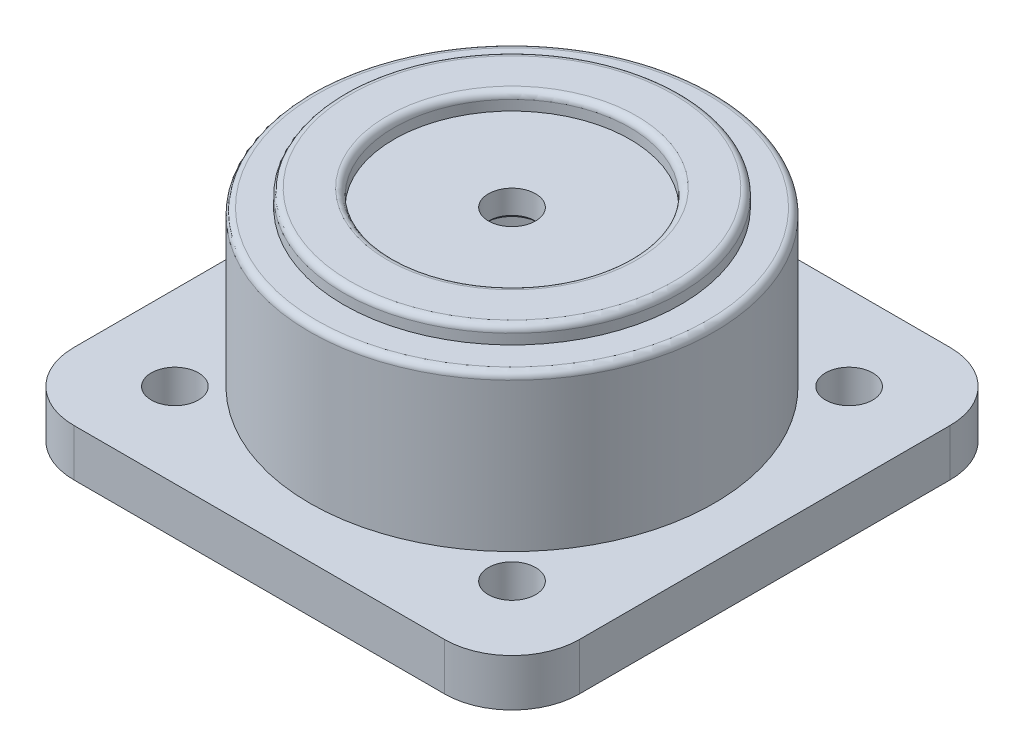
ISO-10303-21;
HEADER;
FILE_DESCRIPTION(('STEP AP214'),'2;1');
FILE_NAME('part.step','',(''),(''),'','','');
FILE_SCHEMA(('AUTOMOTIVE_DESIGN { 1 0 10303 214 1 1 1 1 }'));
ENDSEC;
DATA;
#1=APPLICATION_CONTEXT('core data for automotive mechanical design processes');
#2=APPLICATION_PROTOCOL_DEFINITION('international standard','automotive_design',2000,#1);
#3=PRODUCT_CONTEXT('',#1,'mechanical');
#4=PRODUCT('Part','Part','',(#3));
#5=PRODUCT_RELATED_PRODUCT_CATEGORY('part','',(#4));
#6=PRODUCT_DEFINITION_FORMATION('','',#4);
#7=PRODUCT_DEFINITION_CONTEXT('part definition',#1,'design');
#8=PRODUCT_DEFINITION('design','',#6,#7);
#9=PRODUCT_DEFINITION_SHAPE('','',#8);
#10=(LENGTH_UNIT() NAMED_UNIT(*) SI_UNIT(.MILLI.,.METRE.));
#11=(NAMED_UNIT(*) PLANE_ANGLE_UNIT() SI_UNIT($,.RADIAN.));
#12=(NAMED_UNIT(*) SI_UNIT($,.STERADIAN.) SOLID_ANGLE_UNIT());
#13=UNCERTAINTY_MEASURE_WITH_UNIT(LENGTH_MEASURE(1.E-05),#10,'distance_accuracy_value','');
#14=(GEOMETRIC_REPRESENTATION_CONTEXT(3) GLOBAL_UNCERTAINTY_ASSIGNED_CONTEXT((#13)) GLOBAL_UNIT_ASSIGNED_CONTEXT((#10,
#11,#12)) REPRESENTATION_CONTEXT('',''));
#15=CARTESIAN_POINT('',(0.,0.,0.));
#16=DIRECTION('',(0.,0.,1.));
#17=DIRECTION('',(1.,0.,0.));
#18=AXIS2_PLACEMENT_3D('',#15,#16,#17);
#19=CARTESIAN_POINT('',(0.,30.,0.));
#20=DIRECTION('',(0.,1.,0.));
#21=DIRECTION('',(0.,0.,1.));
#22=AXIS2_PLACEMENT_3D('',#19,#20,#21);
#23=PLANE('',#22);
#24=CARTESIAN_POINT('',(0.,30.,0.));
#25=DIRECTION('',(0.,-1.,0.));
#26=DIRECTION('',(0.,0.,-1.));
#27=AXIS2_PLACEMENT_3D('',#24,#25,#26);
#28=CIRCLE('',#27,3.5);
#29=CARTESIAN_POINT('',(0.,30.,-3.5));
#30=VERTEX_POINT('',#29);
#31=EDGE_CURVE('E161',#30,#30,#28,.T.);
#32=ORIENTED_EDGE('',*,*,#31,.T.);
#33=EDGE_LOOP('',(#32));
#34=FACE_BOUND('',#33,.T.);
#35=CARTESIAN_POINT('',(0.,30.,0.));
#36=DIRECTION('',(0.,1.,0.));
#37=DIRECTION('',(0.,0.,1.));
#38=AXIS2_PLACEMENT_3D('',#35,#36,#37);
#39=CIRCLE('',#38,17.5);
#40=CARTESIAN_POINT('',(0.,30.,17.5));
#41=VERTEX_POINT('',#40);
#42=EDGE_CURVE('E278',#41,#41,#39,.F.);
#43=ORIENTED_EDGE('',*,*,#42,.F.);
#44=EDGE_LOOP('',(#43));
#45=FACE_BOUND('',#44,.T.);
#46=ADVANCED_FACE('F39',(#34,#45),#23,.T.);
#47=CARTESIAN_POINT('',(0.,26.,0.));
#48=DIRECTION('',(0.,1.,0.));
#49=DIRECTION('',(0.,0.,1.));
#50=AXIS2_PLACEMENT_3D('',#47,#48,#49);
#51=PLANE('',#50);
#52=CARTESIAN_POINT('',(0.,26.,0.));
#53=DIRECTION('',(0.,1.,0.));
#54=DIRECTION('',(0.,0.,1.));
#55=AXIS2_PLACEMENT_3D('',#52,#53,#54);
#56=CIRCLE('',#55,4.);
#57=CARTESIAN_POINT('',(0.,26.,4.));
#58=VERTEX_POINT('',#57);
#59=EDGE_CURVE('E266',#58,#58,#56,.T.);
#60=ORIENTED_EDGE('',*,*,#59,.T.);
#61=EDGE_LOOP('',(#60));
#62=FACE_BOUND('',#61,.T.);
#63=CARTESIAN_POINT('',(0.,26.,0.));
#64=DIRECTION('',(0.,-1.,0.));
#65=DIRECTION('',(0.,0.,-1.));
#66=AXIS2_PLACEMENT_3D('',#63,#64,#65);
#67=CIRCLE('',#66,7.5);
#68=CARTESIAN_POINT('',(0.,26.,-7.5));
#69=VERTEX_POINT('',#68);
#70=EDGE_CURVE('E147',#69,#69,#67,.T.);
#71=ORIENTED_EDGE('',*,*,#70,.T.);
#72=EDGE_LOOP('',(#71));
#73=FACE_BOUND('',#72,.T.);
#74=ADVANCED_FACE('F308',(#62,#73),#51,.F.);
#75=CARTESIAN_POINT('',(0.,30.,0.));
#76=DIRECTION('',(0.,-1.,0.));
#77=DIRECTION('',(0.,0.,-1.));
#78=AXIS2_PLACEMENT_3D('',#75,#76,#77);
#79=CYLINDRICAL_SURFACE('',#78,30.);
#80=CARTESIAN_POINT('',(0.,29.,0.));
#81=DIRECTION('',(0.,1.,0.));
#82=DIRECTION('',(0.,0.,1.));
#83=AXIS2_PLACEMENT_3D('',#80,#81,#82);
#84=CIRCLE('',#83,30.);
#85=CARTESIAN_POINT('',(0.,29.,30.));
#86=VERTEX_POINT('',#85);
#87=EDGE_CURVE('E12',#86,#86,#84,.F.);
#88=ORIENTED_EDGE('',*,*,#87,.T.);
#89=EDGE_LOOP('',(#88));
#90=FACE_BOUND('',#89,.T.);
#91=CARTESIAN_POINT('',(0.,23.,0.));
#92=DIRECTION('',(0.,1.,0.));
#93=DIRECTION('',(-1.,0.,0.));
#94=AXIS2_PLACEMENT_3D('',#91,#92,#93);
#95=CIRCLE('',#94,30.);
#96=CARTESIAN_POINT('',(6.,23.,-29.3938769133981));
#97=VERTEX_POINT('',#96);
#98=CARTESIAN_POINT('',(-6.,23.,-29.3938769133981));
#99=VERTEX_POINT('',#98);
#100=EDGE_CURVE('E146',#97,#99,#95,.T.);
#101=ORIENTED_EDGE('',*,*,#100,.T.);
#102=DIRECTION('',(0.,-1.,0.));
#103=VECTOR('',#102,1.);
#104=CARTESIAN_POINT('',(-6.,30.,-29.3938769133981));
#105=LINE('',#104,#103);
#106=CARTESIAN_POINT('',(-6.,15.,-29.3938769133981));
#107=VERTEX_POINT('',#106);
#108=EDGE_CURVE('E136',#99,#107,#105,.T.);
#109=ORIENTED_EDGE('',*,*,#108,.T.);
#110=CARTESIAN_POINT('',(0.,15.,0.));
#111=DIRECTION('',(0.,-1.,0.));
#112=DIRECTION('',(0.,0.,-1.));
#113=AXIS2_PLACEMENT_3D('',#110,#111,#112);
#114=CIRCLE('',#113,30.);
#115=CARTESIAN_POINT('',(6.,15.,-29.3938769133981));
#116=VERTEX_POINT('',#115);
#117=EDGE_CURVE('E125',#107,#116,#114,.T.);
#118=ORIENTED_EDGE('',*,*,#117,.T.);
#119=DIRECTION('',(0.,-1.,0.));
#120=VECTOR('',#119,1.);
#121=CARTESIAN_POINT('',(6.,30.,-29.3938769133981));
#122=LINE('',#121,#120);
#123=EDGE_CURVE('E130',#116,#97,#122,.F.);
#124=ORIENTED_EDGE('',*,*,#123,.T.);
#125=EDGE_LOOP('',(#101,#109,#118,#124));
#126=FACE_BOUND('',#125,.T.);
#127=CARTESIAN_POINT('',(0.,7.,0.));
#128=DIRECTION('',(0.,-1.,0.));
#129=DIRECTION('',(0.,0.,-1.));
#130=AXIS2_PLACEMENT_3D('',#127,#128,#129);
#131=CIRCLE('',#130,30.);
#132=CARTESIAN_POINT('',(0.,7.,-30.));
#133=VERTEX_POINT('',#132);
#134=EDGE_CURVE('E247',#133,#133,#131,.T.);
#135=ORIENTED_EDGE('',*,*,#134,.F.);
#136=EDGE_LOOP('',(#135));
#137=FACE_BOUND('',#136,.T.);
#138=ADVANCED_FACE('F144',(#90,#126,#137),#79,.T.);
#139=CARTESIAN_POINT('',(0.,30.,0.));
#140=DIRECTION('',(0.,1.,0.));
#141=DIRECTION('',(0.,0.,1.));
#142=AXIS2_PLACEMENT_3D('',#139,#140,#141);
#143=CIRCLE('',#142,29.);
#144=CARTESIAN_POINT('',(0.,30.,29.));
#145=VERTEX_POINT('',#144);
#146=EDGE_CURVE('E47',#145,#145,#143,.T.);
#147=ORIENTED_EDGE('',*,*,#146,.T.);
#148=EDGE_LOOP('',(#147));
#149=FACE_BOUND('',#148,.T.);
#150=CARTESIAN_POINT('',(0.,30.,0.));
#151=DIRECTION('',(0.,1.,0.));
#152=DIRECTION('',(0.,0.,1.));
#153=AXIS2_PLACEMENT_3D('',#150,#151,#152);
#154=CIRCLE('',#153,25.);
#155=CARTESIAN_POINT('',(0.,30.,25.));
#156=VERTEX_POINT('',#155);
#157=EDGE_CURVE('E141',#156,#156,#154,.T.);
#158=ORIENTED_EDGE('',*,*,#157,.F.);
#159=EDGE_LOOP('',(#158));
#160=FACE_BOUND('',#159,.T.);
#161=ADVANCED_FACE('F295',(#149,#160),#23,.T.);
#162=CARTESIAN_POINT('',(27.5000000000001,7.,27.5));
#163=DIRECTION('',(0.,-1.,0.));
#164=DIRECTION('',(0.,0.,-1.));
#165=AXIS2_PLACEMENT_3D('',#162,#163,#164);
#166=CYLINDRICAL_SURFACE('',#165,10.);
#167=CARTESIAN_POINT('',(27.5000000000001,0.,27.5));
#168=DIRECTION('',(0.,-1.,0.));
#169=DIRECTION('',(0.,0.,-1.));
#170=AXIS2_PLACEMENT_3D('',#167,#168,#169);
#171=CIRCLE('',#170,10.);
#172=CARTESIAN_POINT('',(37.5000000000001,0.,27.5));
#173=VERTEX_POINT('',#172);
#174=CARTESIAN_POINT('',(27.5000000000001,0.,37.5));
#175=VERTEX_POINT('',#174);
#176=EDGE_CURVE('E194',#173,#175,#171,.T.);
#177=ORIENTED_EDGE('',*,*,#176,.F.);
#178=DIRECTION('',(0.,-1.,0.));
#179=VECTOR('',#178,1.);
#180=CARTESIAN_POINT('',(37.5000000000001,7.,27.5));
#181=LINE('',#180,#179);
#182=CARTESIAN_POINT('',(37.5000000000001,7.,27.5));
#183=VERTEX_POINT('',#182);
#184=EDGE_CURVE('E245',#183,#173,#181,.T.);
#185=ORIENTED_EDGE('',*,*,#184,.F.);
#186=CARTESIAN_POINT('',(27.5000000000001,7.,27.5));
#187=DIRECTION('',(0.,-1.,0.));
#188=DIRECTION('',(0.,0.,-1.));
#189=AXIS2_PLACEMENT_3D('',#186,#187,#188);
#190=CIRCLE('',#189,10.);
#191=CARTESIAN_POINT('',(27.5000000000001,7.,37.5));
#192=VERTEX_POINT('',#191);
#193=EDGE_CURVE('E197',#183,#192,#190,.T.);
#194=ORIENTED_EDGE('',*,*,#193,.T.);
#195=DIRECTION('',(0.,-1.,0.));
#196=VECTOR('',#195,1.);
#197=CARTESIAN_POINT('',(27.5000000000001,7.,37.5));
#198=LINE('',#197,#196);
#199=EDGE_CURVE('E222',#192,#175,#198,.T.);
#200=ORIENTED_EDGE('',*,*,#199,.T.);
#201=EDGE_LOOP('',(#177,#185,#194,#200));
#202=FACE_BOUND('',#201,.T.);
#203=ADVANCED_FACE('F321',(#202),#166,.T.);
#204=CARTESIAN_POINT('',(37.5000000000001,7.,-27.5));
#205=DIRECTION('',(1.,0.,0.));
#206=DIRECTION('',(0.,0.,-1.));
#207=AXIS2_PLACEMENT_3D('',#204,#205,#206);
#208=PLANE('',#207);
#209=DIRECTION('',(0.,0.,1.));
#210=VECTOR('',#209,1.);
#211=CARTESIAN_POINT('',(37.5000000000001,0.,-27.5));
#212=LINE('',#211,#210);
#213=CARTESIAN_POINT('',(37.5000000000001,0.,-27.5));
#214=VERTEX_POINT('',#213);
#215=EDGE_CURVE('E201',#214,#173,#212,.T.);
#216=ORIENTED_EDGE('',*,*,#215,.F.);
#217=DIRECTION('',(0.,-1.,0.));
#218=VECTOR('',#217,1.);
#219=CARTESIAN_POINT('',(37.5000000000001,7.,-27.5));
#220=LINE('',#219,#218);
#221=CARTESIAN_POINT('',(37.5000000000001,7.,-27.5));
#222=VERTEX_POINT('',#221);
#223=EDGE_CURVE('E248',#222,#214,#220,.T.);
#224=ORIENTED_EDGE('',*,*,#223,.F.);
#225=DIRECTION('',(0.,0.,1.));
#226=VECTOR('',#225,1.);
#227=CARTESIAN_POINT('',(37.5000000000001,7.,-27.5));
#228=LINE('',#227,#226);
#229=EDGE_CURVE('E219',#222,#183,#228,.T.);
#230=ORIENTED_EDGE('',*,*,#229,.T.);
#231=ORIENTED_EDGE('',*,*,#184,.T.);
#232=EDGE_LOOP('',(#216,#224,#230,#231));
#233=FACE_BOUND('',#232,.T.);
#234=ADVANCED_FACE('F326',(#233),#208,.T.);
#235=CARTESIAN_POINT('',(27.5000000000001,7.,-27.5));
#236=DIRECTION('',(0.,-1.,0.));
#237=DIRECTION('',(0.,0.,-1.));
#238=AXIS2_PLACEMENT_3D('',#235,#236,#237);
#239=CYLINDRICAL_SURFACE('',#238,10.);
#240=CARTESIAN_POINT('',(27.5000000000001,0.,-27.5));
#241=DIRECTION('',(0.,-1.,0.));
#242=DIRECTION('',(0.,0.,1.));
#243=AXIS2_PLACEMENT_3D('',#240,#241,#242);
#244=CIRCLE('',#243,10.);
#245=CARTESIAN_POINT('',(27.5000000000001,0.,-37.5));
#246=VERTEX_POINT('',#245);
#247=EDGE_CURVE('E240',#246,#214,#244,.T.);
#248=ORIENTED_EDGE('',*,*,#247,.F.);
#249=DIRECTION('',(0.,-1.,0.));
#250=VECTOR('',#249,1.);
#251=CARTESIAN_POINT('',(27.5000000000001,7.,-37.5));
#252=LINE('',#251,#250);
#253=CARTESIAN_POINT('',(27.5000000000001,7.,-37.5));
#254=VERTEX_POINT('',#253);
#255=EDGE_CURVE('E250',#254,#246,#252,.T.);
#256=ORIENTED_EDGE('',*,*,#255,.F.);
#257=CARTESIAN_POINT('',(27.5000000000001,7.,-27.5));
#258=DIRECTION('',(0.,-1.,0.));
#259=DIRECTION('',(0.,0.,1.));
#260=AXIS2_PLACEMENT_3D('',#257,#258,#259);
#261=CIRCLE('',#260,10.);
#262=EDGE_CURVE('E216',#254,#222,#261,.T.);
#263=ORIENTED_EDGE('',*,*,#262,.T.);
#264=ORIENTED_EDGE('',*,*,#223,.T.);
#265=EDGE_LOOP('',(#248,#256,#263,#264));
#266=FACE_BOUND('',#265,.T.);
#267=ADVANCED_FACE('F425',(#266),#239,.T.);
#268=CARTESIAN_POINT('',(-27.5000000000001,7.,-37.5));
#269=DIRECTION('',(0.,0.,-1.));
#270=DIRECTION('',(-1.,0.,0.));
#271=AXIS2_PLACEMENT_3D('',#268,#269,#270);
#272=PLANE('',#271);
#273=DIRECTION('',(1.,0.,0.));
#274=VECTOR('',#273,1.);
#275=CARTESIAN_POINT('',(-27.5000000000001,0.,-37.5));
#276=LINE('',#275,#274);
#277=CARTESIAN_POINT('',(-27.5000000000001,0.,-37.5));
#278=VERTEX_POINT('',#277);
#279=EDGE_CURVE('E237',#278,#246,#276,.T.);
#280=ORIENTED_EDGE('',*,*,#279,.F.);
#281=DIRECTION('',(0.,-1.,0.));
#282=VECTOR('',#281,1.);
#283=CARTESIAN_POINT('',(-27.5000000000001,7.,-37.5));
#284=LINE('',#283,#282);
#285=CARTESIAN_POINT('',(-27.5000000000001,7.,-37.5));
#286=VERTEX_POINT('',#285);
#287=EDGE_CURVE('E252',#286,#278,#284,.T.);
#288=ORIENTED_EDGE('',*,*,#287,.F.);
#289=DIRECTION('',(1.,0.,0.));
#290=VECTOR('',#289,1.);
#291=CARTESIAN_POINT('',(-27.5000000000001,7.,-37.5));
#292=LINE('',#291,#290);
#293=EDGE_CURVE('E213',#286,#254,#292,.T.);
#294=ORIENTED_EDGE('',*,*,#293,.T.);
#295=ORIENTED_EDGE('',*,*,#255,.T.);
#296=EDGE_LOOP('',(#280,#288,#294,#295));
#297=FACE_BOUND('',#296,.T.);
#298=ADVANCED_FACE('F429',(#297),#272,.T.);
#299=CARTESIAN_POINT('',(-27.5000000000001,7.,-27.5));
#300=DIRECTION('',(0.,-1.,0.));
#301=DIRECTION('',(0.,0.,-1.));
#302=AXIS2_PLACEMENT_3D('',#299,#300,#301);
#303=CYLINDRICAL_SURFACE('',#302,10.);
#304=CARTESIAN_POINT('',(-27.5000000000001,0.,-27.5));
#305=DIRECTION('',(0.,-1.,0.));
#306=DIRECTION('',(0.,0.,1.));
#307=AXIS2_PLACEMENT_3D('',#304,#305,#306);
#308=CIRCLE('',#307,10.);
#309=CARTESIAN_POINT('',(-37.5000000000001,0.,-27.5));
#310=VERTEX_POINT('',#309);
#311=EDGE_CURVE('E234',#310,#278,#308,.T.);
#312=ORIENTED_EDGE('',*,*,#311,.F.);
#313=DIRECTION('',(0.,-1.,0.));
#314=VECTOR('',#313,1.);
#315=CARTESIAN_POINT('',(-37.5000000000001,7.,-27.5));
#316=LINE('',#315,#314);
#317=CARTESIAN_POINT('',(-37.5000000000001,7.,-27.5));
#318=VERTEX_POINT('',#317);
#319=EDGE_CURVE('E254',#318,#310,#316,.T.);
#320=ORIENTED_EDGE('',*,*,#319,.F.);
#321=CARTESIAN_POINT('',(-27.5000000000001,7.,-27.5));
#322=DIRECTION('',(0.,-1.,0.));
#323=DIRECTION('',(0.,0.,1.));
#324=AXIS2_PLACEMENT_3D('',#321,#322,#323);
#325=CIRCLE('',#324,10.);
#326=EDGE_CURVE('E210',#318,#286,#325,.T.);
#327=ORIENTED_EDGE('',*,*,#326,.T.);
#328=ORIENTED_EDGE('',*,*,#287,.T.);
#329=EDGE_LOOP('',(#312,#320,#327,#328));
#330=FACE_BOUND('',#329,.T.);
#331=ADVANCED_FACE('F433',(#330),#303,.T.);
#332=CARTESIAN_POINT('',(-37.5000000000001,7.,-27.5));
#333=DIRECTION('',(-1.,0.,0.));
#334=DIRECTION('',(0.,0.,1.));
#335=AXIS2_PLACEMENT_3D('',#332,#333,#334);
#336=PLANE('',#335);
#337=DIRECTION('',(0.,0.,-1.));
#338=VECTOR('',#337,1.);
#339=CARTESIAN_POINT('',(-37.5000000000001,0.,-27.5));
#340=LINE('',#339,#338);
#341=CARTESIAN_POINT('',(-37.5000000000001,0.,27.5));
#342=VERTEX_POINT('',#341);
#343=EDGE_CURVE('E231',#342,#310,#340,.T.);
#344=ORIENTED_EDGE('',*,*,#343,.F.);
#345=DIRECTION('',(0.,-1.,0.));
#346=VECTOR('',#345,1.);
#347=CARTESIAN_POINT('',(-37.5000000000001,7.,27.5));
#348=LINE('',#347,#346);
#349=CARTESIAN_POINT('',(-37.5000000000001,7.,27.5));
#350=VERTEX_POINT('',#349);
#351=EDGE_CURVE('E256',#350,#342,#348,.T.);
#352=ORIENTED_EDGE('',*,*,#351,.F.);
#353=DIRECTION('',(0.,0.,-1.));
#354=VECTOR('',#353,1.);
#355=CARTESIAN_POINT('',(-37.5000000000001,7.,-27.5));
#356=LINE('',#355,#354);
#357=EDGE_CURVE('E207',#350,#318,#356,.T.);
#358=ORIENTED_EDGE('',*,*,#357,.T.);
#359=ORIENTED_EDGE('',*,*,#319,.T.);
#360=EDGE_LOOP('',(#344,#352,#358,#359));
#361=FACE_BOUND('',#360,.T.);
#362=ADVANCED_FACE('F437',(#361),#336,.T.);
#363=CARTESIAN_POINT('',(-27.5000000000001,7.,27.5));
#364=DIRECTION('',(0.,-1.,0.));
#365=DIRECTION('',(0.,0.,-1.));
#366=AXIS2_PLACEMENT_3D('',#363,#364,#365);
#367=CYLINDRICAL_SURFACE('',#366,10.);
#368=CARTESIAN_POINT('',(-27.5000000000001,0.,27.5));
#369=DIRECTION('',(0.,-1.,0.));
#370=DIRECTION('',(0.,0.,-1.));
#371=AXIS2_PLACEMENT_3D('',#368,#369,#370);
#372=CIRCLE('',#371,10.);
#373=CARTESIAN_POINT('',(-27.5000000000001,0.,37.5));
#374=VERTEX_POINT('',#373);
#375=EDGE_CURVE('E228',#374,#342,#372,.T.);
#376=ORIENTED_EDGE('',*,*,#375,.F.);
#377=DIRECTION('',(0.,-1.,0.));
#378=VECTOR('',#377,1.);
#379=CARTESIAN_POINT('',(-27.5000000000001,7.,37.5));
#380=LINE('',#379,#378);
#381=CARTESIAN_POINT('',(-27.5000000000001,7.,37.5));
#382=VERTEX_POINT('',#381);
#383=EDGE_CURVE('E258',#382,#374,#380,.T.);
#384=ORIENTED_EDGE('',*,*,#383,.F.);
#385=CARTESIAN_POINT('',(-27.5000000000001,7.,27.5));
#386=DIRECTION('',(0.,-1.,0.));
#387=DIRECTION('',(0.,0.,-1.));
#388=AXIS2_PLACEMENT_3D('',#385,#386,#387);
#389=CIRCLE('',#388,10.);
#390=EDGE_CURVE('E204',#382,#350,#389,.T.);
#391=ORIENTED_EDGE('',*,*,#390,.T.);
#392=ORIENTED_EDGE('',*,*,#351,.T.);
#393=EDGE_LOOP('',(#376,#384,#391,#392));
#394=FACE_BOUND('',#393,.T.);
#395=ADVANCED_FACE('F441',(#394),#367,.T.);
#396=CARTESIAN_POINT('',(-27.5000000000001,7.,37.5));
#397=DIRECTION('',(0.,0.,1.));
#398=DIRECTION('',(1.,0.,0.));
#399=AXIS2_PLACEMENT_3D('',#396,#397,#398);
#400=PLANE('',#399);
#401=DIRECTION('',(-1.,0.,0.));
#402=VECTOR('',#401,1.);
#403=CARTESIAN_POINT('',(-27.5000000000001,0.,37.5));
#404=LINE('',#403,#402);
#405=EDGE_CURVE('E225',#175,#374,#404,.T.);
#406=ORIENTED_EDGE('',*,*,#405,.F.);
#407=ORIENTED_EDGE('',*,*,#199,.F.);
#408=DIRECTION('',(-1.,0.,0.));
#409=VECTOR('',#408,1.);
#410=CARTESIAN_POINT('',(-27.5000000000001,7.,37.5));
#411=LINE('',#410,#409);
#412=EDGE_CURVE('E200',#192,#382,#411,.T.);
#413=ORIENTED_EDGE('',*,*,#412,.T.);
#414=ORIENTED_EDGE('',*,*,#383,.T.);
#415=EDGE_LOOP('',(#406,#407,#413,#414));
#416=FACE_BOUND('',#415,.T.);
#417=ADVANCED_FACE('F421',(#416),#400,.T.);
#418=CARTESIAN_POINT('',(27.5000000000001,7.,27.5));
#419=DIRECTION('',(0.,-1.,0.));
#420=DIRECTION('',(0.,0.,-1.));
#421=AXIS2_PLACEMENT_3D('',#418,#419,#420);
#422=PLANE('',#421);
#423=ORIENTED_EDGE('',*,*,#134,.T.);
#424=EDGE_LOOP('',(#423));
#425=FACE_BOUND('',#424,.T.);
#426=CARTESIAN_POINT('',(24.9999987842491,7.,-24.9999987842491));
#427=DIRECTION('',(0.,-1.,0.));
#428=DIRECTION('',(0.,0.,-1.));
#429=AXIS2_PLACEMENT_3D('',#426,#427,#428);
#430=CIRCLE('',#429,3.5);
#431=CARTESIAN_POINT('',(24.9999987842491,7.,-28.4999987842491));
#432=VERTEX_POINT('',#431);
#433=EDGE_CURVE('E173',#432,#432,#430,.T.);
#434=ORIENTED_EDGE('',*,*,#433,.T.);
#435=EDGE_LOOP('',(#434));
#436=FACE_BOUND('',#435,.T.);
#437=CARTESIAN_POINT('',(25.0000012157509,7.,25.0000012157509));
#438=DIRECTION('',(0.,-1.,0.));
#439=DIRECTION('',(0.,0.,-1.));
#440=AXIS2_PLACEMENT_3D('',#437,#438,#439);
#441=CIRCLE('',#440,3.49999999999999);
#442=CARTESIAN_POINT('',(25.0000012157509,7.,21.5000012157509));
#443=VERTEX_POINT('',#442);
#444=EDGE_CURVE('E179',#443,#443,#441,.T.);
#445=ORIENTED_EDGE('',*,*,#444,.T.);
#446=EDGE_LOOP('',(#445));
#447=FACE_BOUND('',#446,.T.);
#448=CARTESIAN_POINT('',(-25.0000012157509,7.,-25.0000012157509));
#449=DIRECTION('',(0.,-1.,0.));
#450=DIRECTION('',(0.,0.,-1.));
#451=AXIS2_PLACEMENT_3D('',#448,#449,#450);
#452=CIRCLE('',#451,3.5);
#453=CARTESIAN_POINT('',(-25.0000012157509,7.,-28.5000012157509));
#454=VERTEX_POINT('',#453);
#455=EDGE_CURVE('E185',#454,#454,#452,.T.);
#456=ORIENTED_EDGE('',*,*,#455,.T.);
#457=EDGE_LOOP('',(#456));
#458=FACE_BOUND('',#457,.T.);
#459=CARTESIAN_POINT('',(-24.9999987842491,7.,24.9999987842491));
#460=DIRECTION('',(0.,-1.,0.));
#461=DIRECTION('',(0.,0.,-1.));
#462=AXIS2_PLACEMENT_3D('',#459,#460,#461);
#463=CIRCLE('',#462,3.5);
#464=CARTESIAN_POINT('',(-24.9999987842491,7.,21.4999987842491));
#465=VERTEX_POINT('',#464);
#466=EDGE_CURVE('E191',#465,#465,#463,.T.);
#467=ORIENTED_EDGE('',*,*,#466,.T.);
#468=EDGE_LOOP('',(#467));
#469=FACE_BOUND('',#468,.T.);
#470=ORIENTED_EDGE('',*,*,#193,.F.);
#471=ORIENTED_EDGE('',*,*,#229,.F.);
#472=ORIENTED_EDGE('',*,*,#262,.F.);
#473=ORIENTED_EDGE('',*,*,#293,.F.);
#474=ORIENTED_EDGE('',*,*,#326,.F.);
#475=ORIENTED_EDGE('',*,*,#357,.F.);
#476=ORIENTED_EDGE('',*,*,#390,.F.);
#477=ORIENTED_EDGE('',*,*,#412,.F.);
#478=EDGE_LOOP('',(#470,#471,#472,#473,#474,#475,#476,#477));
#479=FACE_BOUND('',#478,.T.);
#480=ADVANCED_FACE('F417',(#425,#436,#447,#458,#469,#479),#422,.F.);
#481=CARTESIAN_POINT('',(-24.9999987842491,7.,24.9999987842491));
#482=DIRECTION('',(0.,-1.,0.));
#483=DIRECTION('',(0.,0.,-1.));
#484=AXIS2_PLACEMENT_3D('',#481,#482,#483);
#485=CYLINDRICAL_SURFACE('',#484,3.5);
#486=ORIENTED_EDGE('',*,*,#466,.F.);
#487=EDGE_LOOP('',(#486));
#488=FACE_BOUND('',#487,.T.);
#489=CARTESIAN_POINT('',(-24.9999987842491,0.,24.9999987842491));
#490=DIRECTION('',(0.,-1.,0.));
#491=DIRECTION('',(0.,0.,-1.));
#492=AXIS2_PLACEMENT_3D('',#489,#490,#491);
#493=CIRCLE('',#492,3.5);
#494=CARTESIAN_POINT('',(-24.9999987842491,0.,21.4999987842491));
#495=VERTEX_POINT('',#494);
#496=EDGE_CURVE('E188',#495,#495,#493,.T.);
#497=ORIENTED_EDGE('',*,*,#496,.T.);
#498=EDGE_LOOP('',(#497));
#499=FACE_BOUND('',#498,.T.);
#500=ADVANCED_FACE('F413',(#488,#499),#485,.F.);
#501=CARTESIAN_POINT('',(-25.0000012157509,7.,-25.0000012157509));
#502=DIRECTION('',(0.,-1.,0.));
#503=DIRECTION('',(0.,0.,-1.));
#504=AXIS2_PLACEMENT_3D('',#501,#502,#503);
#505=CYLINDRICAL_SURFACE('',#504,3.5);
#506=ORIENTED_EDGE('',*,*,#455,.F.);
#507=EDGE_LOOP('',(#506));
#508=FACE_BOUND('',#507,.T.);
#509=CARTESIAN_POINT('',(-25.0000012157509,0.,-25.0000012157509));
#510=DIRECTION('',(0.,-1.,0.));
#511=DIRECTION('',(0.,0.,-1.));
#512=AXIS2_PLACEMENT_3D('',#509,#510,#511);
#513=CIRCLE('',#512,3.5);
#514=CARTESIAN_POINT('',(-25.0000012157509,0.,-28.5000012157509));
#515=VERTEX_POINT('',#514);
#516=EDGE_CURVE('E182',#515,#515,#513,.T.);
#517=ORIENTED_EDGE('',*,*,#516,.T.);
#518=EDGE_LOOP('',(#517));
#519=FACE_BOUND('',#518,.T.);
#520=ADVANCED_FACE('F409',(#508,#519),#505,.F.);
#521=CARTESIAN_POINT('',(25.0000012157509,7.,25.0000012157509));
#522=DIRECTION('',(0.,-1.,0.));
#523=DIRECTION('',(0.,0.,-1.));
#524=AXIS2_PLACEMENT_3D('',#521,#522,#523);
#525=CYLINDRICAL_SURFACE('',#524,3.49999999999999);
#526=ORIENTED_EDGE('',*,*,#444,.F.);
#527=EDGE_LOOP('',(#526));
#528=FACE_BOUND('',#527,.T.);
#529=CARTESIAN_POINT('',(25.0000012157509,0.,25.0000012157509));
#530=DIRECTION('',(0.,-1.,0.));
#531=DIRECTION('',(0.,0.,-1.));
#532=AXIS2_PLACEMENT_3D('',#529,#530,#531);
#533=CIRCLE('',#532,3.49999999999999);
#534=CARTESIAN_POINT('',(25.0000012157509,0.,21.5000012157509));
#535=VERTEX_POINT('',#534);
#536=EDGE_CURVE('E176',#535,#535,#533,.T.);
#537=ORIENTED_EDGE('',*,*,#536,.T.);
#538=EDGE_LOOP('',(#537));
#539=FACE_BOUND('',#538,.T.);
#540=ADVANCED_FACE('F405',(#528,#539),#525,.F.);
#541=CARTESIAN_POINT('',(24.9999987842491,7.,-24.9999987842491));
#542=DIRECTION('',(0.,-1.,0.));
#543=DIRECTION('',(0.,0.,-1.));
#544=AXIS2_PLACEMENT_3D('',#541,#542,#543);
#545=CYLINDRICAL_SURFACE('',#544,3.5);
#546=ORIENTED_EDGE('',*,*,#433,.F.);
#547=EDGE_LOOP('',(#546));
#548=FACE_BOUND('',#547,.T.);
#549=CARTESIAN_POINT('',(24.9999987842491,0.,-24.9999987842491));
#550=DIRECTION('',(0.,-1.,0.));
#551=DIRECTION('',(0.,0.,-1.));
#552=AXIS2_PLACEMENT_3D('',#549,#550,#551);
#553=CIRCLE('',#552,3.5);
#554=CARTESIAN_POINT('',(24.9999987842491,0.,-28.4999987842491));
#555=VERTEX_POINT('',#554);
#556=EDGE_CURVE('E172',#555,#555,#553,.T.);
#557=ORIENTED_EDGE('',*,*,#556,.T.);
#558=EDGE_LOOP('',(#557));
#559=FACE_BOUND('',#558,.T.);
#560=ADVANCED_FACE('F402',(#548,#559),#545,.F.);
#561=CARTESIAN_POINT('',(0.,0.,0.));
#562=DIRECTION('',(0.,1.,0.));
#563=DIRECTION('',(0.,0.,1.));
#564=AXIS2_PLACEMENT_3D('',#561,#562,#563);
#565=PLANE('',#564);
#566=CARTESIAN_POINT('',(0.,0.,0.));
#567=DIRECTION('',(0.,-1.,0.));
#568=DIRECTION('',(0.,0.,-1.));
#569=AXIS2_PLACEMENT_3D('',#566,#567,#568);
#570=CIRCLE('',#569,24.);
#571=CARTESIAN_POINT('',(0.,0.,-24.));
#572=VERTEX_POINT('',#571);
#573=EDGE_CURVE('E166',#572,#572,#570,.T.);
#574=ORIENTED_EDGE('',*,*,#573,.F.);
#575=EDGE_LOOP('',(#574));
#576=FACE_BOUND('',#575,.T.);
#577=ORIENTED_EDGE('',*,*,#556,.F.);
#578=EDGE_LOOP('',(#577));
#579=FACE_BOUND('',#578,.T.);
#580=ORIENTED_EDGE('',*,*,#536,.F.);
#581=EDGE_LOOP('',(#580));
#582=FACE_BOUND('',#581,.T.);
#583=ORIENTED_EDGE('',*,*,#516,.F.);
#584=EDGE_LOOP('',(#583));
#585=FACE_BOUND('',#584,.T.);
#586=ORIENTED_EDGE('',*,*,#496,.F.);
#587=EDGE_LOOP('',(#586));
#588=FACE_BOUND('',#587,.T.);
#589=ORIENTED_EDGE('',*,*,#176,.T.);
#590=ORIENTED_EDGE('',*,*,#405,.T.);
#591=ORIENTED_EDGE('',*,*,#375,.T.);
#592=ORIENTED_EDGE('',*,*,#343,.T.);
#593=ORIENTED_EDGE('',*,*,#311,.T.);
#594=ORIENTED_EDGE('',*,*,#279,.T.);
#595=ORIENTED_EDGE('',*,*,#247,.T.);
#596=ORIENTED_EDGE('',*,*,#215,.T.);
#597=EDGE_LOOP('',(#589,#590,#591,#592,#593,#594,#595,#596));
#598=FACE_BOUND('',#597,.T.);
#599=ADVANCED_FACE('F333',(#576,#579,#582,#585,#588,#598),#565,.F.);
#600=CARTESIAN_POINT('',(0.,26.,0.));
#601=DIRECTION('',(0.,-1.,0.));
#602=DIRECTION('',(0.,0.,-1.));
#603=AXIS2_PLACEMENT_3D('',#600,#601,#602);
#604=CIRCLE('',#603,8.5);
#605=CARTESIAN_POINT('',(0.,26.,-8.5));
#606=VERTEX_POINT('',#605);
#607=EDGE_CURVE('E156',#606,#606,#604,.T.);
#608=ORIENTED_EDGE('',*,*,#607,.F.);
#609=EDGE_LOOP('',(#608));
#610=FACE_BOUND('',#609,.T.);
#611=CARTESIAN_POINT('',(0.,26.,0.));
#612=DIRECTION('',(0.,1.,0.));
#613=DIRECTION('',(0.,0.,1.));
#614=AXIS2_PLACEMENT_3D('',#611,#612,#613);
#615=CIRCLE('',#614,24.);
#616=CARTESIAN_POINT('',(0.,26.,24.));
#617=VERTEX_POINT('',#616);
#618=EDGE_CURVE('E169',#617,#617,#615,.F.);
#619=ORIENTED_EDGE('',*,*,#618,.T.);
#620=EDGE_LOOP('',(#619));
#621=FACE_BOUND('',#620,.T.);
#622=ADVANCED_FACE('F316',(#610,#621),#51,.F.);
#623=CARTESIAN_POINT('',(0.,97.8822509939086,0.));
#624=DIRECTION('',(0.,-1.,0.));
#625=DIRECTION('',(0.,0.,-1.));
#626=AXIS2_PLACEMENT_3D('',#623,#624,#625);
#627=CYLINDRICAL_SURFACE('',#626,24.);
#628=CARTESIAN_POINT('',(0.,15.,0.));
#629=DIRECTION('',(0.,-1.,0.));
#630=DIRECTION('',(0.,0.,-1.));
#631=AXIS2_PLACEMENT_3D('',#628,#629,#630);
#632=CIRCLE('',#631,24.);
#633=CARTESIAN_POINT('',(6.,15.,-23.2379000772445));
#634=VERTEX_POINT('',#633);
#635=CARTESIAN_POINT('',(-6.,15.,-23.2379000772445));
#636=VERTEX_POINT('',#635);
#637=EDGE_CURVE('E269',#634,#636,#632,.F.);
#638=ORIENTED_EDGE('',*,*,#637,.T.);
#639=DIRECTION('',(0.,-1.,0.));
#640=VECTOR('',#639,1.);
#641=CARTESIAN_POINT('',(-5.99999999999999,97.8822509939086,-23.2379000772445));
#642=LINE('',#641,#640);
#643=CARTESIAN_POINT('',(-6.,23.,-23.2379000772445));
#644=VERTEX_POINT('',#643);
#645=EDGE_CURVE('E139',#636,#644,#642,.F.);
#646=ORIENTED_EDGE('',*,*,#645,.T.);
#647=CARTESIAN_POINT('',(0.,23.,0.));
#648=DIRECTION('',(0.,1.,0.));
#649=DIRECTION('',(-1.,0.,0.));
#650=AXIS2_PLACEMENT_3D('',#647,#648,#649);
#651=CIRCLE('',#650,24.);
#652=CARTESIAN_POINT('',(6.,23.,-23.2379000772445));
#653=VERTEX_POINT('',#652);
#654=EDGE_CURVE('E274',#644,#653,#651,.F.);
#655=ORIENTED_EDGE('',*,*,#654,.T.);
#656=DIRECTION('',(0.,-1.,0.));
#657=VECTOR('',#656,1.);
#658=CARTESIAN_POINT('',(6.,97.8822509939086,-23.2379000772445));
#659=LINE('',#658,#657);
#660=EDGE_CURVE('E271',#653,#634,#659,.T.);
#661=ORIENTED_EDGE('',*,*,#660,.T.);
#662=EDGE_LOOP('',(#638,#646,#655,#661));
#663=FACE_BOUND('',#662,.T.);
#664=ORIENTED_EDGE('',*,*,#573,.T.);
#665=EDGE_LOOP('',(#664));
#666=FACE_BOUND('',#665,.T.);
#667=ORIENTED_EDGE('',*,*,#618,.F.);
#668=EDGE_LOOP('',(#667));
#669=FACE_BOUND('',#668,.T.);
#670=ADVANCED_FACE('F395',(#663,#666,#669),#627,.F.);
#671=CARTESIAN_POINT('',(0.,30.,0.));
#672=DIRECTION('',(0.,-1.,0.));
#673=DIRECTION('',(0.,0.,-1.));
#674=AXIS2_PLACEMENT_3D('',#671,#672,#673);
#675=CYLINDRICAL_SURFACE('',#674,3.5);
#676=CARTESIAN_POINT('',(0.,26.5,0.));
#677=DIRECTION('',(0.,1.,0.));
#678=DIRECTION('',(0.,0.,1.));
#679=AXIS2_PLACEMENT_3D('',#676,#677,#678);
#680=CIRCLE('',#679,3.5);
#681=CARTESIAN_POINT('',(0.,26.5,3.5));
#682=VERTEX_POINT('',#681);
#683=EDGE_CURVE('E263',#682,#682,#680,.F.);
#684=ORIENTED_EDGE('',*,*,#683,.T.);
#685=EDGE_LOOP('',(#684));
#686=FACE_BOUND('',#685,.T.);
#687=ORIENTED_EDGE('',*,*,#31,.F.);
#688=EDGE_LOOP('',(#687));
#689=FACE_BOUND('',#688,.T.);
#690=ADVANCED_FACE('F391',(#686,#689),#675,.F.);
#691=CARTESIAN_POINT('',(0.,28.5,0.));
#692=DIRECTION('',(0.,-1.,0.));
#693=DIRECTION('',(0.,0.,-1.));
#694=AXIS2_PLACEMENT_3D('',#691,#692,#693);
#695=CYLINDRICAL_SURFACE('',#694,8.5);
#696=CARTESIAN_POINT('',(0.,28.5,0.));
#697=DIRECTION('',(0.,-1.,0.));
#698=DIRECTION('',(0.,0.,-1.));
#699=AXIS2_PLACEMENT_3D('',#696,#697,#698);
#700=CIRCLE('',#699,8.5);
#701=CARTESIAN_POINT('',(0.,28.5,-8.5));
#702=VERTEX_POINT('',#701);
#703=EDGE_CURVE('E158',#702,#702,#700,.T.);
#704=ORIENTED_EDGE('',*,*,#703,.F.);
#705=EDGE_LOOP('',(#704));
#706=FACE_BOUND('',#705,.T.);
#707=ORIENTED_EDGE('',*,*,#607,.T.);
#708=EDGE_LOOP('',(#707));
#709=FACE_BOUND('',#708,.T.);
#710=ADVANCED_FACE('F387',(#706,#709),#695,.F.);
#711=CARTESIAN_POINT('',(0.,28.5,0.));
#712=DIRECTION('',(0.,-1.,0.));
#713=DIRECTION('',(0.,0.,-1.));
#714=AXIS2_PLACEMENT_3D('',#711,#712,#713);
#715=PLANE('',#714);
#716=CARTESIAN_POINT('',(0.,28.5,0.));
#717=DIRECTION('',(0.,-1.,0.));
#718=DIRECTION('',(0.,0.,-1.));
#719=AXIS2_PLACEMENT_3D('',#716,#717,#718);
#720=CIRCLE('',#719,7.5);
#721=CARTESIAN_POINT('',(0.,28.5,-7.5));
#722=VERTEX_POINT('',#721);
#723=EDGE_CURVE('E150',#722,#722,#720,.T.);
#724=ORIENTED_EDGE('',*,*,#723,.F.);
#725=EDGE_LOOP('',(#724));
#726=FACE_BOUND('',#725,.T.);
#727=ORIENTED_EDGE('',*,*,#703,.T.);
#728=EDGE_LOOP('',(#727));
#729=FACE_BOUND('',#728,.T.);
#730=ADVANCED_FACE('F383',(#726,#729),#715,.T.);
#731=CARTESIAN_POINT('',(0.,28.5,0.));
#732=DIRECTION('',(0.,-1.,0.));
#733=DIRECTION('',(0.,0.,-1.));
#734=AXIS2_PLACEMENT_3D('',#731,#732,#733);
#735=CYLINDRICAL_SURFACE('',#734,7.5);
#736=ORIENTED_EDGE('',*,*,#723,.T.);
#737=EDGE_LOOP('',(#736));
#738=FACE_BOUND('',#737,.T.);
#739=ORIENTED_EDGE('',*,*,#70,.F.);
#740=EDGE_LOOP('',(#739));
#741=FACE_BOUND('',#740,.T.);
#742=ADVANCED_FACE('F340',(#738,#741),#735,.T.);
#743=CARTESIAN_POINT('',(0.,26.5,0.));
#744=DIRECTION('',(0.,-1.,0.));
#745=DIRECTION('',(0.,0.,-1.));
#746=AXIS2_PLACEMENT_3D('',#743,#744,#745);
#747=CONICAL_SURFACE('',#746,3.5,0.785398163397455);
#748=ORIENTED_EDGE('',*,*,#59,.F.);
#749=EDGE_LOOP('',(#748));
#750=FACE_BOUND('',#749,.T.);
#751=ORIENTED_EDGE('',*,*,#683,.F.);
#752=EDGE_LOOP('',(#751));
#753=FACE_BOUND('',#752,.T.);
#754=ADVANCED_FACE('F335',(#750,#753),#747,.F.);
#755=CARTESIAN_POINT('',(-6.,15.,-49.));
#756=DIRECTION('',(-1.,0.,0.));
#757=DIRECTION('',(0.,-1.,0.));
#758=AXIS2_PLACEMENT_3D('',#755,#756,#757);
#759=PLANE('',#758);
#760=DIRECTION('',(0.,0.,1.));
#761=VECTOR('',#760,1.);
#762=CARTESIAN_POINT('',(-6.,23.,-49.));
#763=LINE('',#762,#761);
#764=EDGE_CURVE('E131',#99,#644,#763,.T.);
#765=ORIENTED_EDGE('',*,*,#764,.T.);
#766=ORIENTED_EDGE('',*,*,#645,.F.);
#767=DIRECTION('',(0.,0.,1.));
#768=VECTOR('',#767,1.);
#769=CARTESIAN_POINT('',(-6.,15.,-49.));
#770=LINE('',#769,#768);
#771=EDGE_CURVE('E59',#107,#636,#770,.T.);
#772=ORIENTED_EDGE('',*,*,#771,.F.);
#773=ORIENTED_EDGE('',*,*,#108,.F.);
#774=EDGE_LOOP('',(#765,#766,#772,#773));
#775=FACE_BOUND('',#774,.T.);
#776=ADVANCED_FACE('F135',(#775),#759,.F.);
#777=CARTESIAN_POINT('',(-6.,23.,-49.));
#778=DIRECTION('',(0.,1.,0.));
#779=DIRECTION('',(-1.,0.,0.));
#780=AXIS2_PLACEMENT_3D('',#777,#778,#779);
#781=PLANE('',#780);
#782=DIRECTION('',(0.,0.,1.));
#783=VECTOR('',#782,1.);
#784=CARTESIAN_POINT('',(6.,23.,-49.));
#785=LINE('',#784,#783);
#786=EDGE_CURVE('E699',#97,#653,#785,.T.);
#787=ORIENTED_EDGE('',*,*,#786,.T.);
#788=ORIENTED_EDGE('',*,*,#654,.F.);
#789=ORIENTED_EDGE('',*,*,#764,.F.);
#790=ORIENTED_EDGE('',*,*,#100,.F.);
#791=EDGE_LOOP('',(#787,#788,#789,#790));
#792=FACE_BOUND('',#791,.T.);
#793=ADVANCED_FACE('F372',(#792),#781,.F.);
#794=CARTESIAN_POINT('',(6.,15.,-49.));
#795=DIRECTION('',(1.,0.,0.));
#796=DIRECTION('',(0.,0.,-1.));
#797=AXIS2_PLACEMENT_3D('',#794,#795,#796);
#798=PLANE('',#797);
#799=DIRECTION('',(0.,0.,1.));
#800=VECTOR('',#799,1.);
#801=CARTESIAN_POINT('',(6.,15.,-49.));
#802=LINE('',#801,#800);
#803=EDGE_CURVE('E54',#116,#634,#802,.T.);
#804=ORIENTED_EDGE('',*,*,#803,.T.);
#805=ORIENTED_EDGE('',*,*,#660,.F.);
#806=ORIENTED_EDGE('',*,*,#786,.F.);
#807=ORIENTED_EDGE('',*,*,#123,.F.);
#808=EDGE_LOOP('',(#804,#805,#806,#807));
#809=FACE_BOUND('',#808,.T.);
#810=ADVANCED_FACE('F369',(#809),#798,.F.);
#811=CARTESIAN_POINT('',(-6.,15.,-49.));
#812=DIRECTION('',(0.,-1.,0.));
#813=DIRECTION('',(0.,0.,-1.));
#814=AXIS2_PLACEMENT_3D('',#811,#812,#813);
#815=PLANE('',#814);
#816=ORIENTED_EDGE('',*,*,#771,.T.);
#817=ORIENTED_EDGE('',*,*,#637,.F.);
#818=ORIENTED_EDGE('',*,*,#803,.F.);
#819=ORIENTED_EDGE('',*,*,#117,.F.);
#820=EDGE_LOOP('',(#816,#817,#818,#819));
#821=FACE_BOUND('',#820,.T.);
#822=ADVANCED_FACE('F126',(#821),#815,.F.);
#823=CARTESIAN_POINT('',(0.,32.5,0.));
#824=DIRECTION('',(0.,1.,0.));
#825=DIRECTION('',(0.,0.,1.));
#826=AXIS2_PLACEMENT_3D('',#823,#824,#825);
#827=PLANE('',#826);
#828=CARTESIAN_POINT('',(0.,32.5,0.));
#829=DIRECTION('',(0.,1.,0.));
#830=DIRECTION('',(0.,0.,1.));
#831=AXIS2_PLACEMENT_3D('',#828,#829,#830);
#832=CIRCLE('',#831,18.5);
#833=CARTESIAN_POINT('',(0.,32.5,18.5));
#834=VERTEX_POINT('',#833);
#835=EDGE_CURVE('E287',#834,#834,#832,.F.);
#836=ORIENTED_EDGE('',*,*,#835,.T.);
#837=EDGE_LOOP('',(#836));
#838=FACE_BOUND('',#837,.T.);
#839=CARTESIAN_POINT('',(0.,32.5,0.));
#840=DIRECTION('',(0.,1.,0.));
#841=DIRECTION('',(0.,0.,1.));
#842=AXIS2_PLACEMENT_3D('',#839,#840,#841);
#843=CIRCLE('',#842,24.);
#844=CARTESIAN_POINT('',(0.,32.5,24.));
#845=VERTEX_POINT('',#844);
#846=EDGE_CURVE('E284',#845,#845,#843,.T.);
#847=ORIENTED_EDGE('',*,*,#846,.T.);
#848=EDGE_LOOP('',(#847));
#849=FACE_BOUND('',#848,.T.);
#850=ADVANCED_FACE('F357',(#838,#849),#827,.T.);
#851=CARTESIAN_POINT('',(0.,32.5,0.));
#852=DIRECTION('',(0.,-1.,0.));
#853=DIRECTION('',(0.,0.,-1.));
#854=AXIS2_PLACEMENT_3D('',#851,#852,#853);
#855=CYLINDRICAL_SURFACE('',#854,25.);
#856=CARTESIAN_POINT('',(0.,31.5,0.));
#857=DIRECTION('',(0.,1.,0.));
#858=DIRECTION('',(0.,0.,1.));
#859=AXIS2_PLACEMENT_3D('',#856,#857,#858);
#860=CIRCLE('',#859,25.);
#861=CARTESIAN_POINT('',(0.,31.5,25.));
#862=VERTEX_POINT('',#861);
#863=EDGE_CURVE('E290',#862,#862,#860,.F.);
#864=ORIENTED_EDGE('',*,*,#863,.T.);
#865=EDGE_LOOP('',(#864));
#866=FACE_BOUND('',#865,.T.);
#867=ORIENTED_EDGE('',*,*,#157,.T.);
#868=EDGE_LOOP('',(#867));
#869=FACE_BOUND('',#868,.T.);
#870=ADVANCED_FACE('F348',(#866,#869),#855,.T.);
#871=CARTESIAN_POINT('',(0.,32.5,0.));
#872=DIRECTION('',(0.,-1.,0.));
#873=DIRECTION('',(0.,0.,-1.));
#874=AXIS2_PLACEMENT_3D('',#871,#872,#873);
#875=CYLINDRICAL_SURFACE('',#874,17.5);
#876=CARTESIAN_POINT('',(0.,31.5,0.));
#877=DIRECTION('',(0.,1.,0.));
#878=DIRECTION('',(0.,0.,1.));
#879=AXIS2_PLACEMENT_3D('',#876,#877,#878);
#880=CIRCLE('',#879,17.5);
#881=CARTESIAN_POINT('',(0.,31.5,17.5));
#882=VERTEX_POINT('',#881);
#883=EDGE_CURVE('E281',#882,#882,#880,.T.);
#884=ORIENTED_EDGE('',*,*,#883,.T.);
#885=EDGE_LOOP('',(#884));
#886=FACE_BOUND('',#885,.T.);
#887=ORIENTED_EDGE('',*,*,#42,.T.);
#888=EDGE_LOOP('',(#887));
#889=FACE_BOUND('',#888,.T.);
#890=ADVANCED_FACE('F343',(#886,#889),#875,.F.);
#891=CARTESIAN_POINT('',(0.,31.5,0.));
#892=DIRECTION('',(0.,1.,0.));
#893=DIRECTION('',(0.,0.,1.));
#894=AXIS2_PLACEMENT_3D('',#891,#892,#893);
#895=TOROIDAL_SURFACE('',#894,18.5,1.);
#896=ORIENTED_EDGE('',*,*,#835,.F.);
#897=EDGE_LOOP('',(#896));
#898=FACE_BOUND('',#897,.T.);
#899=ORIENTED_EDGE('',*,*,#883,.F.);
#900=EDGE_LOOP('',(#899));
#901=FACE_BOUND('',#900,.T.);
#902=ADVANCED_FACE('F304',(#898,#901),#895,.T.);
#903=CARTESIAN_POINT('',(0.,31.5,0.));
#904=DIRECTION('',(0.,1.,0.));
#905=DIRECTION('',(0.,0.,1.));
#906=AXIS2_PLACEMENT_3D('',#903,#904,#905);
#907=TOROIDAL_SURFACE('',#906,24.,1.);
#908=ORIENTED_EDGE('',*,*,#863,.F.);
#909=EDGE_LOOP('',(#908));
#910=FACE_BOUND('',#909,.T.);
#911=ORIENTED_EDGE('',*,*,#846,.F.);
#912=EDGE_LOOP('',(#911));
#913=FACE_BOUND('',#912,.T.);
#914=ADVANCED_FACE('F299',(#910,#913),#907,.T.);
#915=CARTESIAN_POINT('',(0.,29.,0.));
#916=DIRECTION('',(0.,1.,0.));
#917=DIRECTION('',(0.,0.,1.));
#918=AXIS2_PLACEMENT_3D('',#915,#916,#917);
#919=TOROIDAL_SURFACE('',#918,29.,1.);
#920=ORIENTED_EDGE('',*,*,#87,.F.);
#921=EDGE_LOOP('',(#920));
#922=FACE_BOUND('',#921,.T.);
#923=ORIENTED_EDGE('',*,*,#146,.F.);
#924=EDGE_LOOP('',(#923));
#925=FACE_BOUND('',#924,.T.);
#926=ADVANCED_FACE('F41',(#922,#925),#919,.T.);
#927=CLOSED_SHELL('',(#46,#74,#138,#161,#203,#234,#267,#298,#331,#362,#395,#417,#480,#500,#520,
#540,#560,#599,#622,#670,#690,#710,#730,#742,#754,#776,#793,#810,#822,#850,#870,#890,#902,#914,#926));
#928=MANIFOLD_SOLID_BREP('B2',#927);
#929=ADVANCED_BREP_SHAPE_REPRESENTATION('',(#18,#928),#14);
#930=SHAPE_DEFINITION_REPRESENTATION(#9,#929);
ENDSEC;
END-ISO-10303-21;
